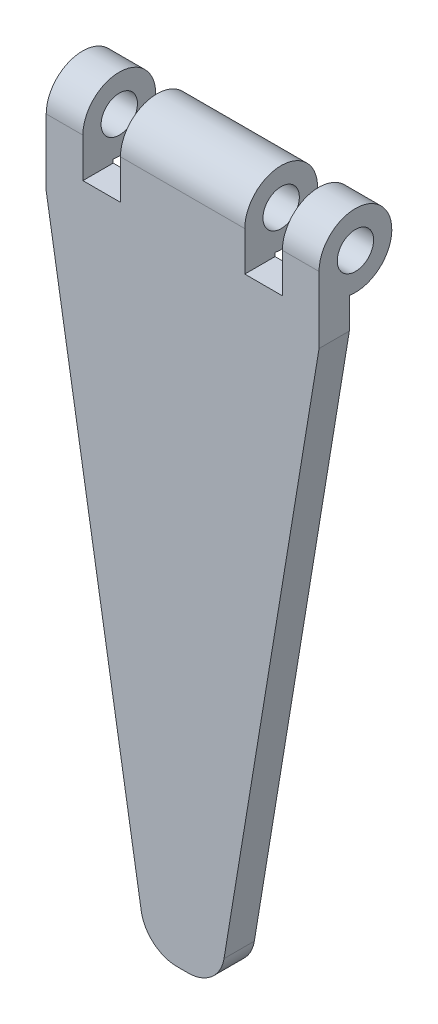
ISO-10303-21;
HEADER;
FILE_DESCRIPTION(('STEP AP214'),'2;1');
FILE_NAME('part.step','',(''),(''),'','','');
FILE_SCHEMA(('AUTOMOTIVE_DESIGN { 1 0 10303 214 1 1 1 1 }'));
ENDSEC;
DATA;
#1=APPLICATION_CONTEXT('core data for automotive mechanical design processes');
#2=APPLICATION_PROTOCOL_DEFINITION('international standard','automotive_design',2000,#1);
#3=PRODUCT_CONTEXT('',#1,'mechanical');
#4=PRODUCT('Part','Part','',(#3));
#5=PRODUCT_RELATED_PRODUCT_CATEGORY('part','',(#4));
#6=PRODUCT_DEFINITION_FORMATION('','',#4);
#7=PRODUCT_DEFINITION_CONTEXT('part definition',#1,'design');
#8=PRODUCT_DEFINITION('design','',#6,#7);
#9=PRODUCT_DEFINITION_SHAPE('','',#8);
#10=(LENGTH_UNIT() NAMED_UNIT(*) SI_UNIT(.MILLI.,.METRE.));
#11=(NAMED_UNIT(*) PLANE_ANGLE_UNIT() SI_UNIT($,.RADIAN.));
#12=(NAMED_UNIT(*) SI_UNIT($,.STERADIAN.) SOLID_ANGLE_UNIT());
#13=UNCERTAINTY_MEASURE_WITH_UNIT(LENGTH_MEASURE(1.E-05),#10,'distance_accuracy_value','');
#14=(GEOMETRIC_REPRESENTATION_CONTEXT(3) GLOBAL_UNCERTAINTY_ASSIGNED_CONTEXT((#13)) GLOBAL_UNIT_ASSIGNED_CONTEXT((#10,
#11,#12)) REPRESENTATION_CONTEXT('',''));
#15=CARTESIAN_POINT('',(0.,0.,0.));
#16=DIRECTION('',(0.,0.,1.));
#17=DIRECTION('',(1.,0.,0.));
#18=AXIS2_PLACEMENT_3D('',#15,#16,#17);
#19=CARTESIAN_POINT('',(0.,0.,5.));
#20=DIRECTION('',(0.,0.,-1.));
#21=DIRECTION('',(-1.,0.,0.));
#22=AXIS2_PLACEMENT_3D('',#19,#20,#21);
#23=PLANE('',#22);
#24=DIRECTION('',(1.,0.,0.));
#25=VECTOR('',#24,1.);
#26=CARTESIAN_POINT('',(-6.00000000000002,-108.5,5.));
#27=LINE('',#26,#25);
#28=CARTESIAN_POINT('',(-0.917358670530017,-108.5,5.));
#29=VERTEX_POINT('',#28);
#30=CARTESIAN_POINT('',(0.917358670529975,-108.5,5.));
#31=VERTEX_POINT('',#30);
#32=EDGE_CURVE('E239',#29,#31,#27,.T.);
#33=ORIENTED_EDGE('',*,*,#32,.T.);
#34=CARTESIAN_POINT('',(0.917358670529975,-102.51,5.));
#35=DIRECTION('',(0.,0.,-1.));
#36=DIRECTION('',(-1.,0.,0.));
#37=AXIS2_PLACEMENT_3D('',#34,#35,#36);
#38=CIRCLE('',#37,5.99);
#39=CARTESIAN_POINT('',(6.82744782282865,-103.485164710129,5.));
#40=VERTEX_POINT('',#39);
#41=EDGE_CURVE('E59',#31,#40,#38,.F.);
#42=ORIENTED_EDGE('',*,*,#41,.T.);
#43=DIRECTION('',(0.162798782993202,0.986659290867893,0.));
#44=VECTOR('',#43,1.);
#45=CARTESIAN_POINT('',(22.5,-8.5,5.));
#46=LINE('',#45,#44);
#47=CARTESIAN_POINT('',(22.5,-8.5,5.));
#48=VERTEX_POINT('',#47);
#49=EDGE_CURVE('E237',#40,#48,#46,.T.);
#50=ORIENTED_EDGE('',*,*,#49,.T.);
#51=DIRECTION('',(0.,1.,0.));
#52=VECTOR('',#51,1.);
#53=CARTESIAN_POINT('',(22.5,-8.5,5.));
#54=LINE('',#53,#52);
#55=CARTESIAN_POINT('',(22.5,2.5,5.));
#56=VERTEX_POINT('',#55);
#57=EDGE_CURVE('E184',#48,#56,#54,.T.);
#58=ORIENTED_EDGE('',*,*,#57,.T.);
#59=DIRECTION('',(1.,0.,0.));
#60=VECTOR('',#59,1.);
#61=CARTESIAN_POINT('',(-22.5,2.5,5.));
#62=LINE('',#61,#60);
#63=CARTESIAN_POINT('',(16.45,2.5,5.));
#64=VERTEX_POINT('',#63);
#65=EDGE_CURVE('E294',#64,#56,#62,.T.);
#66=ORIENTED_EDGE('',*,*,#65,.F.);
#67=DIRECTION('',(0.,1.,0.));
#68=VECTOR('',#67,1.);
#69=CARTESIAN_POINT('',(16.45,0.,5.));
#70=LINE('',#69,#68);
#71=CARTESIAN_POINT('',(16.45,-4.,5.));
#72=VERTEX_POINT('',#71);
#73=EDGE_CURVE('E275',#72,#64,#70,.T.);
#74=ORIENTED_EDGE('',*,*,#73,.F.);
#75=DIRECTION('',(1.,0.,0.));
#76=VECTOR('',#75,1.);
#77=CARTESIAN_POINT('',(0.,-4.,5.));
#78=LINE('',#77,#76);
#79=CARTESIAN_POINT('',(10.25,-4.,5.));
#80=VERTEX_POINT('',#79);
#81=EDGE_CURVE('E272',#80,#72,#78,.T.);
#82=ORIENTED_EDGE('',*,*,#81,.F.);
#83=DIRECTION('',(0.,1.,0.));
#84=VECTOR('',#83,1.);
#85=CARTESIAN_POINT('',(10.25,0.,5.));
#86=LINE('',#85,#84);
#87=CARTESIAN_POINT('',(10.25,2.5,5.));
#88=VERTEX_POINT('',#87);
#89=EDGE_CURVE('E256',#80,#88,#86,.T.);
#90=ORIENTED_EDGE('',*,*,#89,.T.);
#91=CARTESIAN_POINT('',(-10.25,2.5,5.));
#92=VERTEX_POINT('',#91);
#93=EDGE_CURVE('E299',#92,#88,#62,.T.);
#94=ORIENTED_EDGE('',*,*,#93,.F.);
#95=DIRECTION('',(0.,1.,0.));
#96=VECTOR('',#95,1.);
#97=CARTESIAN_POINT('',(-10.25,0.,5.));
#98=LINE('',#97,#96);
#99=CARTESIAN_POINT('',(-10.25,-4.,5.));
#100=VERTEX_POINT('',#99);
#101=EDGE_CURVE('E264',#100,#92,#98,.T.);
#102=ORIENTED_EDGE('',*,*,#101,.F.);
#103=DIRECTION('',(1.,0.,0.));
#104=VECTOR('',#103,1.);
#105=CARTESIAN_POINT('',(0.,-4.,5.));
#106=LINE('',#105,#104);
#107=CARTESIAN_POINT('',(-16.45,-4.,5.));
#108=VERTEX_POINT('',#107);
#109=EDGE_CURVE('E260',#108,#100,#106,.T.);
#110=ORIENTED_EDGE('',*,*,#109,.F.);
#111=DIRECTION('',(0.,1.,0.));
#112=VECTOR('',#111,1.);
#113=CARTESIAN_POINT('',(-16.45,0.,5.));
#114=LINE('',#113,#112);
#115=CARTESIAN_POINT('',(-16.45,2.5,5.));
#116=VERTEX_POINT('',#115);
#117=EDGE_CURVE('E257',#108,#116,#114,.T.);
#118=ORIENTED_EDGE('',*,*,#117,.T.);
#119=CARTESIAN_POINT('',(-22.5,2.5,5.));
#120=VERTEX_POINT('',#119);
#121=EDGE_CURVE('E295',#120,#116,#62,.T.);
#122=ORIENTED_EDGE('',*,*,#121,.F.);
#123=DIRECTION('',(0.,-1.,0.));
#124=VECTOR('',#123,1.);
#125=CARTESIAN_POINT('',(-22.5,-8.5,5.));
#126=LINE('',#125,#124);
#127=CARTESIAN_POINT('',(-22.5,-8.5,5.));
#128=VERTEX_POINT('',#127);
#129=EDGE_CURVE('E194',#120,#128,#126,.T.);
#130=ORIENTED_EDGE('',*,*,#129,.T.);
#131=DIRECTION('',(0.162798782993202,-0.986659290867893,0.));
#132=VECTOR('',#131,1.);
#133=CARTESIAN_POINT('',(-6.00000000000002,-108.5,5.));
#134=LINE('',#133,#132);
#135=CARTESIAN_POINT('',(-6.82744782282869,-103.485164710129,5.));
#136=VERTEX_POINT('',#135);
#137=EDGE_CURVE('E174',#128,#136,#134,.T.);
#138=ORIENTED_EDGE('',*,*,#137,.T.);
#139=CARTESIAN_POINT('',(-0.917358670530017,-102.51,5.));
#140=DIRECTION('',(0.,0.,-1.));
#141=DIRECTION('',(-1.,0.,0.));
#142=AXIS2_PLACEMENT_3D('',#139,#140,#141);
#143=CIRCLE('',#142,5.99);
#144=EDGE_CURVE('E232',#136,#29,#143,.F.);
#145=ORIENTED_EDGE('',*,*,#144,.T.);
#146=EDGE_LOOP('',(#33,#42,#50,#58,#66,#74,#82,#90,#94,#102,#110,#118,#122,#130,#138,#145));
#147=FACE_BOUND('',#146,.T.);
#148=ADVANCED_FACE('F51',(#147),#23,.F.);
#149=CARTESIAN_POINT('',(0.,0.,0.));
#150=DIRECTION('',(0.,0.,-1.));
#151=DIRECTION('',(-1.,0.,0.));
#152=AXIS2_PLACEMENT_3D('',#149,#150,#151);
#153=PLANE('',#152);
#154=DIRECTION('',(-0.162798782993202,-0.986659290867892,0.));
#155=VECTOR('',#154,1.);
#156=CARTESIAN_POINT('',(22.5,-8.5,0.));
#157=LINE('',#156,#155);
#158=CARTESIAN_POINT('',(22.5,-8.5,0.));
#159=VERTEX_POINT('',#158);
#160=CARTESIAN_POINT('',(6.82744782282866,-103.485164710129,0.));
#161=VERTEX_POINT('',#160);
#162=EDGE_CURVE('E249',#159,#161,#157,.T.);
#163=ORIENTED_EDGE('',*,*,#162,.T.);
#164=CARTESIAN_POINT('',(0.917358670529975,-102.51,0.));
#165=DIRECTION('',(0.,0.,-1.));
#166=DIRECTION('',(-1.,0.,0.));
#167=AXIS2_PLACEMENT_3D('',#164,#165,#166);
#168=CIRCLE('',#167,5.99);
#169=CARTESIAN_POINT('',(0.917358670529975,-108.5,0.));
#170=VERTEX_POINT('',#169);
#171=EDGE_CURVE('E226',#161,#170,#168,.T.);
#172=ORIENTED_EDGE('',*,*,#171,.T.);
#173=DIRECTION('',(-1.,0.,0.));
#174=VECTOR('',#173,1.);
#175=CARTESIAN_POINT('',(-6.00000000000002,-108.5,0.));
#176=LINE('',#175,#174);
#177=CARTESIAN_POINT('',(-0.917358670530017,-108.5,0.));
#178=VERTEX_POINT('',#177);
#179=EDGE_CURVE('E175',#170,#178,#176,.T.);
#180=ORIENTED_EDGE('',*,*,#179,.T.);
#181=CARTESIAN_POINT('',(-0.917358670530017,-102.51,0.));
#182=DIRECTION('',(0.,0.,-1.));
#183=DIRECTION('',(-1.,0.,0.));
#184=AXIS2_PLACEMENT_3D('',#181,#182,#183);
#185=CIRCLE('',#184,5.99);
#186=CARTESIAN_POINT('',(-6.82744782282869,-103.485164710129,0.));
#187=VERTEX_POINT('',#186);
#188=EDGE_CURVE('E172',#178,#187,#185,.T.);
#189=ORIENTED_EDGE('',*,*,#188,.T.);
#190=DIRECTION('',(-0.162798782993202,0.986659290867892,0.));
#191=VECTOR('',#190,1.);
#192=CARTESIAN_POINT('',(-6.00000000000002,-108.5,0.));
#193=LINE('',#192,#191);
#194=CARTESIAN_POINT('',(-22.5,-8.5,0.));
#195=VERTEX_POINT('',#194);
#196=EDGE_CURVE('E165',#187,#195,#193,.T.);
#197=ORIENTED_EDGE('',*,*,#196,.T.);
#198=DIRECTION('',(0.,-1.,0.));
#199=VECTOR('',#198,1.);
#200=CARTESIAN_POINT('',(-22.5,-8.5,0.));
#201=LINE('',#200,#199);
#202=CARTESIAN_POINT('',(-22.5,-3.41607978309962,0.));
#203=VERTEX_POINT('',#202);
#204=EDGE_CURVE('E170',#203,#195,#201,.T.);
#205=ORIENTED_EDGE('',*,*,#204,.F.);
#206=DIRECTION('',(1.,0.,0.));
#207=VECTOR('',#206,1.);
#208=CARTESIAN_POINT('',(-22.5,-3.41607978309962,0.));
#209=LINE('',#208,#207);
#210=CARTESIAN_POINT('',(-16.45,-3.41607978309962,0.));
#211=VERTEX_POINT('',#210);
#212=EDGE_CURVE('E188',#211,#203,#209,.F.);
#213=ORIENTED_EDGE('',*,*,#212,.F.);
#214=DIRECTION('',(0.,-1.,0.));
#215=VECTOR('',#214,1.);
#216=CARTESIAN_POINT('',(-16.45,0.,0.));
#217=LINE('',#216,#215);
#218=CARTESIAN_POINT('',(-16.45,-4.,0.));
#219=VERTEX_POINT('',#218);
#220=EDGE_CURVE('E291',#211,#219,#217,.T.);
#221=ORIENTED_EDGE('',*,*,#220,.T.);
#222=DIRECTION('',(-1.,0.,0.));
#223=VECTOR('',#222,1.);
#224=CARTESIAN_POINT('',(0.,-4.,0.));
#225=LINE('',#224,#223);
#226=CARTESIAN_POINT('',(-10.25,-4.,0.));
#227=VERTEX_POINT('',#226);
#228=EDGE_CURVE('E220',#227,#219,#225,.T.);
#229=ORIENTED_EDGE('',*,*,#228,.F.);
#230=DIRECTION('',(0.,-1.,0.));
#231=VECTOR('',#230,1.);
#232=CARTESIAN_POINT('',(-10.25,0.,0.));
#233=LINE('',#232,#231);
#234=CARTESIAN_POINT('',(-10.25,-3.41607978309962,0.));
#235=VERTEX_POINT('',#234);
#236=EDGE_CURVE('E218',#235,#227,#233,.T.);
#237=ORIENTED_EDGE('',*,*,#236,.F.);
#238=CARTESIAN_POINT('',(10.25,-3.41607978309962,0.));
#239=VERTEX_POINT('',#238);
#240=EDGE_CURVE('E191',#239,#235,#209,.F.);
#241=ORIENTED_EDGE('',*,*,#240,.F.);
#242=DIRECTION('',(0.,-1.,0.));
#243=VECTOR('',#242,1.);
#244=CARTESIAN_POINT('',(10.25,0.,0.));
#245=LINE('',#244,#243);
#246=CARTESIAN_POINT('',(10.25,-4.,0.));
#247=VERTEX_POINT('',#246);
#248=EDGE_CURVE('E213',#239,#247,#245,.T.);
#249=ORIENTED_EDGE('',*,*,#248,.T.);
#250=DIRECTION('',(-1.,0.,0.));
#251=VECTOR('',#250,1.);
#252=CARTESIAN_POINT('',(0.,-4.,0.));
#253=LINE('',#252,#251);
#254=CARTESIAN_POINT('',(16.45,-4.,0.));
#255=VERTEX_POINT('',#254);
#256=EDGE_CURVE('E198',#255,#247,#253,.T.);
#257=ORIENTED_EDGE('',*,*,#256,.F.);
#258=DIRECTION('',(0.,-1.,0.));
#259=VECTOR('',#258,1.);
#260=CARTESIAN_POINT('',(16.45,0.,0.));
#261=LINE('',#260,#259);
#262=CARTESIAN_POINT('',(16.45,-3.41607978309962,0.));
#263=VERTEX_POINT('',#262);
#264=EDGE_CURVE('E208',#263,#255,#261,.T.);
#265=ORIENTED_EDGE('',*,*,#264,.F.);
#266=CARTESIAN_POINT('',(22.5,-3.41607978309962,0.));
#267=VERTEX_POINT('',#266);
#268=EDGE_CURVE('E193',#267,#263,#209,.F.);
#269=ORIENTED_EDGE('',*,*,#268,.F.);
#270=DIRECTION('',(0.,1.,0.));
#271=VECTOR('',#270,1.);
#272=CARTESIAN_POINT('',(22.5,-8.5,0.));
#273=LINE('',#272,#271);
#274=EDGE_CURVE('E185',#159,#267,#273,.T.);
#275=ORIENTED_EDGE('',*,*,#274,.F.);
#276=EDGE_LOOP('',(#163,#172,#180,#189,#197,#205,#213,#221,#229,#237,#241,#249,#257,#265,#269,#275));
#277=FACE_BOUND('',#276,.T.);
#278=ADVANCED_FACE('F168',(#277),#153,.T.);
#279=CARTESIAN_POINT('',(-22.5,2.5,-1.));
#280=DIRECTION('',(1.,0.,0.));
#281=DIRECTION('',(0.,0.,-1.));
#282=AXIS2_PLACEMENT_3D('',#279,#280,#281);
#283=CYLINDRICAL_SURFACE('',#282,6.);
#284=ORIENTED_EDGE('',*,*,#121,.T.);
#285=CARTESIAN_POINT('',(-16.45,2.5,-1.));
#286=DIRECTION('',(1.,0.,0.));
#287=DIRECTION('',(0.,0.,-1.));
#288=AXIS2_PLACEMENT_3D('',#285,#286,#287);
#289=CIRCLE('',#288,6.);
#290=EDGE_CURVE('E217',#116,#211,#289,.F.);
#291=ORIENTED_EDGE('',*,*,#290,.T.);
#292=ORIENTED_EDGE('',*,*,#212,.T.);
#293=CARTESIAN_POINT('',(-22.5,2.5,-1.));
#294=DIRECTION('',(1.,0.,0.));
#295=DIRECTION('',(0.,0.,-1.));
#296=AXIS2_PLACEMENT_3D('',#293,#294,#295);
#297=CIRCLE('',#296,6.);
#298=EDGE_CURVE('E183',#203,#120,#297,.T.);
#299=ORIENTED_EDGE('',*,*,#298,.T.);
#300=EDGE_LOOP('',(#284,#291,#292,#299));
#301=FACE_BOUND('',#300,.T.);
#302=ADVANCED_FACE('F348',(#301),#283,.T.);
#303=CARTESIAN_POINT('',(-10.25,2.5,-1.));
#304=DIRECTION('',(1.,0.,0.));
#305=DIRECTION('',(0.,0.,-1.));
#306=AXIS2_PLACEMENT_3D('',#303,#304,#305);
#307=CIRCLE('',#306,6.);
#308=EDGE_CURVE('E212',#92,#235,#307,.F.);
#309=ORIENTED_EDGE('',*,*,#308,.F.);
#310=ORIENTED_EDGE('',*,*,#93,.T.);
#311=CARTESIAN_POINT('',(10.25,2.5,-1.));
#312=DIRECTION('',(1.,0.,0.));
#313=DIRECTION('',(0.,0.,-1.));
#314=AXIS2_PLACEMENT_3D('',#311,#312,#313);
#315=CIRCLE('',#314,6.);
#316=EDGE_CURVE('E207',#88,#239,#315,.F.);
#317=ORIENTED_EDGE('',*,*,#316,.T.);
#318=ORIENTED_EDGE('',*,*,#240,.T.);
#319=EDGE_LOOP('',(#309,#310,#317,#318));
#320=FACE_BOUND('',#319,.T.);
#321=ADVANCED_FACE('F324',(#320),#283,.T.);
#322=CARTESIAN_POINT('',(16.45,2.5,-1.));
#323=DIRECTION('',(1.,0.,0.));
#324=DIRECTION('',(0.,0.,-1.));
#325=AXIS2_PLACEMENT_3D('',#322,#323,#324);
#326=CIRCLE('',#325,6.);
#327=EDGE_CURVE('E202',#64,#263,#326,.F.);
#328=ORIENTED_EDGE('',*,*,#327,.F.);
#329=ORIENTED_EDGE('',*,*,#65,.T.);
#330=CARTESIAN_POINT('',(22.5,2.5,-1.));
#331=DIRECTION('',(1.,0.,0.));
#332=DIRECTION('',(0.,0.,-1.));
#333=AXIS2_PLACEMENT_3D('',#330,#331,#332);
#334=CIRCLE('',#333,6.);
#335=EDGE_CURVE('E303',#267,#56,#334,.T.);
#336=ORIENTED_EDGE('',*,*,#335,.F.);
#337=ORIENTED_EDGE('',*,*,#268,.T.);
#338=EDGE_LOOP('',(#328,#329,#336,#337));
#339=FACE_BOUND('',#338,.T.);
#340=ADVANCED_FACE('F318',(#339),#283,.T.);
#341=CARTESIAN_POINT('',(-22.5,2.5,-1.));
#342=DIRECTION('',(1.,0.,0.));
#343=DIRECTION('',(0.,0.,-1.));
#344=AXIS2_PLACEMENT_3D('',#341,#342,#343);
#345=CYLINDRICAL_SURFACE('',#344,3.);
#346=CARTESIAN_POINT('',(-22.5,2.5,-1.));
#347=DIRECTION('',(1.,0.,0.));
#348=DIRECTION('',(0.,0.,-1.));
#349=AXIS2_PLACEMENT_3D('',#346,#347,#348);
#350=CIRCLE('',#349,3.);
#351=CARTESIAN_POINT('',(-22.5,2.5,-4.));
#352=VERTEX_POINT('',#351);
#353=EDGE_CURVE('E300',#352,#352,#350,.T.);
#354=CARTESIAN_POINT('',(-16.45,2.5,-1.));
#355=DIRECTION('',(1.,0.,0.));
#356=DIRECTION('',(0.,0.,-1.));
#357=AXIS2_PLACEMENT_3D('',#354,#355,#356);
#358=CIRCLE('',#357,3.);
#359=CARTESIAN_POINT('',(-16.45,2.5,-4.));
#360=VERTEX_POINT('',#359);
#361=EDGE_CURVE('E214',#360,#360,#358,.F.);
#362=CARTESIAN_POINT('',(-22.5,2.5,-4.));
#363=CARTESIAN_POINT('',(-22.4369791666667,2.5,-4.));
#364=CARTESIAN_POINT('',(-22.3739583333333,2.5,-4.));
#365=CARTESIAN_POINT('',(-22.2479166666667,2.5,-4.));
#366=CARTESIAN_POINT('',(-22.1848958333333,2.5,-4.));
#367=CARTESIAN_POINT('',(-22.0588541666667,2.5,-4.));
#368=CARTESIAN_POINT('',(-21.9958333333333,2.5,-4.));
#369=CARTESIAN_POINT('',(-21.8697916666667,2.5,-4.));
#370=CARTESIAN_POINT('',(-21.8067708333333,2.5,-4.));
#371=CARTESIAN_POINT('',(-21.6807291666667,2.5,-4.));
#372=CARTESIAN_POINT('',(-21.6177083333333,2.5,-4.));
#373=CARTESIAN_POINT('',(-21.4916666666667,2.5,-4.));
#374=CARTESIAN_POINT('',(-21.4286458333333,2.5,-4.));
#375=CARTESIAN_POINT('',(-21.3026041666667,2.5,-4.));
#376=CARTESIAN_POINT('',(-21.2395833333333,2.5,-4.));
#377=CARTESIAN_POINT('',(-21.1135416666667,2.5,-4.));
#378=CARTESIAN_POINT('',(-21.0505208333333,2.5,-4.));
#379=CARTESIAN_POINT('',(-20.9244791666667,2.5,-4.));
#380=CARTESIAN_POINT('',(-20.8614583333333,2.5,-4.));
#381=CARTESIAN_POINT('',(-20.7354166666667,2.5,-4.));
#382=CARTESIAN_POINT('',(-20.6723958333333,2.5,-4.));
#383=CARTESIAN_POINT('',(-20.5463541666667,2.5,-4.));
#384=CARTESIAN_POINT('',(-20.4833333333333,2.5,-4.));
#385=CARTESIAN_POINT('',(-20.3572916666667,2.5,-4.));
#386=CARTESIAN_POINT('',(-20.2942708333333,2.5,-4.));
#387=CARTESIAN_POINT('',(-20.1682291666667,2.5,-4.));
#388=CARTESIAN_POINT('',(-20.1052083333333,2.5,-4.));
#389=CARTESIAN_POINT('',(-19.9791666666667,2.5,-4.));
#390=CARTESIAN_POINT('',(-19.9161458333333,2.5,-4.));
#391=CARTESIAN_POINT('',(-19.7901041666667,2.5,-4.));
#392=CARTESIAN_POINT('',(-19.7270833333333,2.5,-4.));
#393=CARTESIAN_POINT('',(-19.6010416666667,2.5,-4.));
#394=CARTESIAN_POINT('',(-19.5380208333333,2.5,-4.));
#395=CARTESIAN_POINT('',(-19.4119791666667,2.5,-4.));
#396=CARTESIAN_POINT('',(-19.3489583333333,2.5,-4.));
#397=CARTESIAN_POINT('',(-19.2229166666667,2.5,-4.));
#398=CARTESIAN_POINT('',(-19.1598958333333,2.5,-4.));
#399=CARTESIAN_POINT('',(-19.0338541666667,2.5,-4.));
#400=CARTESIAN_POINT('',(-18.9708333333333,2.5,-4.));
#401=CARTESIAN_POINT('',(-18.8447916666667,2.5,-4.));
#402=CARTESIAN_POINT('',(-18.7817708333333,2.5,-4.));
#403=CARTESIAN_POINT('',(-18.6557291666667,2.5,-4.));
#404=CARTESIAN_POINT('',(-18.5927083333333,2.5,-4.));
#405=CARTESIAN_POINT('',(-18.4666666666667,2.5,-4.));
#406=CARTESIAN_POINT('',(-18.4036458333333,2.5,-4.));
#407=CARTESIAN_POINT('',(-18.2776041666667,2.5,-4.));
#408=CARTESIAN_POINT('',(-18.2145833333333,2.5,-4.));
#409=CARTESIAN_POINT('',(-18.0885416666667,2.5,-4.));
#410=CARTESIAN_POINT('',(-18.0255208333333,2.5,-4.));
#411=CARTESIAN_POINT('',(-17.8994791666667,2.5,-4.));
#412=CARTESIAN_POINT('',(-17.8364583333333,2.5,-4.));
#413=CARTESIAN_POINT('',(-17.7104166666667,2.5,-4.));
#414=CARTESIAN_POINT('',(-17.6473958333333,2.5,-4.));
#415=CARTESIAN_POINT('',(-17.5213541666667,2.5,-4.));
#416=CARTESIAN_POINT('',(-17.4583333333333,2.5,-4.));
#417=CARTESIAN_POINT('',(-17.3322916666667,2.5,-4.));
#418=CARTESIAN_POINT('',(-17.2692708333333,2.5,-4.));
#419=CARTESIAN_POINT('',(-17.1432291666667,2.5,-4.));
#420=CARTESIAN_POINT('',(-17.0802083333333,2.5,-4.));
#421=CARTESIAN_POINT('',(-16.9541666666667,2.5,-4.));
#422=CARTESIAN_POINT('',(-16.8911458333333,2.5,-4.));
#423=CARTESIAN_POINT('',(-16.7651041666667,2.5,-4.));
#424=CARTESIAN_POINT('',(-16.7020833333333,2.5,-4.));
#425=CARTESIAN_POINT('',(-16.5760416666667,2.5,-4.));
#426=CARTESIAN_POINT('',(-16.5130208333333,2.5,-4.));
#427=CARTESIAN_POINT('',(-16.45,2.5,-4.));
#428=B_SPLINE_CURVE_WITH_KNOTS('',3,(#362,#363,#364,#365,#366,#367,#368,#369,#370,#371,#372,
#373,#374,#375,#376,#377,#378,#379,#380,#381,#382,#383,#384,#385,#386,#387,#388,#389,#390,#391,
#392,#393,#394,#395,#396,#397,#398,#399,#400,#401,#402,#403,#404,#405,#406,#407,#408,#409,#410,
#411,#412,#413,#414,#415,#416,#417,#418,#419,#420,#421,#422,#423,#424,#425,#426,#427),
.UNSPECIFIED.,.F.,.F.,(4,2,2,2,2,2,2,2,2,2,2,2,2,2,2,2,2,2,2,2,2,2,2,2,2,2,2,2,2,2,2,2,4),(0.,
0.1890625,0.378125,0.5671875,0.75625,0.9453125,1.134375,1.3234375,1.5125,1.7015625,1.890625,
2.0796875,2.26875,2.4578125,2.646875,2.8359375,3.025,3.2140625,3.403125,3.5921875,3.78125,
3.9703125,4.159375,4.3484375,4.5375,4.7265625,4.915625,5.1046875,5.29375,5.4828125,5.671875,
5.8609375,6.05),.UNSPECIFIED.);
#429=EDGE_CURVE('BSEAM356',#352,#360,#428,.T.);
#430=ORIENTED_EDGE('',*,*,#353,.F.);
#431=ORIENTED_EDGE('',*,*,#361,.F.);
#432=ORIENTED_EDGE('',*,*,#429,.T.);
#433=ORIENTED_EDGE('',*,*,#429,.F.);
#434=EDGE_LOOP('',(#430,#432,#431,#433));
#435=FACE_BOUND('',#434,.T.);
#436=ADVANCED_FACE('F356',(#435),#345,.F.);
#437=CARTESIAN_POINT('',(22.5,-8.5,5.));
#438=DIRECTION('',(-1.,0.,0.));
#439=DIRECTION('',(0.,0.,1.));
#440=AXIS2_PLACEMENT_3D('',#437,#438,#439);
#441=PLANE('',#440);
#442=CARTESIAN_POINT('',(22.5,2.5,-1.));
#443=DIRECTION('',(1.,0.,0.));
#444=DIRECTION('',(0.,0.,-1.));
#445=AXIS2_PLACEMENT_3D('',#442,#443,#444);
#446=CIRCLE('',#445,3.);
#447=CARTESIAN_POINT('',(22.5,2.5,-4.));
#448=VERTEX_POINT('',#447);
#449=EDGE_CURVE('E298',#448,#448,#446,.T.);
#450=ORIENTED_EDGE('',*,*,#449,.F.);
#451=EDGE_LOOP('',(#450));
#452=FACE_BOUND('',#451,.T.);
#453=ORIENTED_EDGE('',*,*,#335,.T.);
#454=ORIENTED_EDGE('',*,*,#57,.F.);
#455=DIRECTION('',(0.,0.,-1.));
#456=VECTOR('',#455,1.);
#457=CARTESIAN_POINT('',(22.5,-8.5,5.));
#458=LINE('',#457,#456);
#459=EDGE_CURVE('E189',#48,#159,#458,.T.);
#460=ORIENTED_EDGE('',*,*,#459,.T.);
#461=ORIENTED_EDGE('',*,*,#274,.T.);
#462=EDGE_LOOP('',(#453,#454,#460,#461));
#463=FACE_BOUND('',#462,.T.);
#464=ADVANCED_FACE('F313',(#452,#463),#441,.F.);
#465=CARTESIAN_POINT('',(-22.5,-8.5,5.));
#466=DIRECTION('',(1.,0.,0.));
#467=DIRECTION('',(0.,0.,-1.));
#468=AXIS2_PLACEMENT_3D('',#465,#466,#467);
#469=PLANE('',#468);
#470=ORIENTED_EDGE('',*,*,#353,.T.);
#471=EDGE_LOOP('',(#470));
#472=FACE_BOUND('',#471,.T.);
#473=ORIENTED_EDGE('',*,*,#129,.F.);
#474=ORIENTED_EDGE('',*,*,#298,.F.);
#475=ORIENTED_EDGE('',*,*,#204,.T.);
#476=DIRECTION('',(0.,0.,-1.));
#477=VECTOR('',#476,1.);
#478=CARTESIAN_POINT('',(-22.5,-8.5,5.));
#479=LINE('',#478,#477);
#480=EDGE_CURVE('E182',#128,#195,#479,.T.);
#481=ORIENTED_EDGE('',*,*,#480,.F.);
#482=EDGE_LOOP('',(#473,#474,#475,#481));
#483=FACE_BOUND('',#482,.T.);
#484=ADVANCED_FACE('F181',(#472,#483),#469,.F.);
#485=CARTESIAN_POINT('',(16.45,2.5,-1.));
#486=DIRECTION('',(1.,0.,0.));
#487=DIRECTION('',(0.,0.,-1.));
#488=AXIS2_PLACEMENT_3D('',#485,#486,#487);
#489=CIRCLE('',#488,3.);
#490=CARTESIAN_POINT('',(16.45,2.5,-4.));
#491=VERTEX_POINT('',#490);
#492=EDGE_CURVE('E199',#491,#491,#489,.F.);
#493=CARTESIAN_POINT('',(16.45,2.5,-4.));
#494=CARTESIAN_POINT('',(16.5130208333333,2.5,-4.));
#495=CARTESIAN_POINT('',(16.5760416666667,2.5,-4.));
#496=CARTESIAN_POINT('',(16.7020833333333,2.5,-4.));
#497=CARTESIAN_POINT('',(16.7651041666667,2.5,-4.));
#498=CARTESIAN_POINT('',(16.8911458333333,2.5,-4.));
#499=CARTESIAN_POINT('',(16.9541666666667,2.5,-4.));
#500=CARTESIAN_POINT('',(17.0802083333333,2.5,-4.));
#501=CARTESIAN_POINT('',(17.1432291666667,2.5,-4.));
#502=CARTESIAN_POINT('',(17.2692708333333,2.5,-4.));
#503=CARTESIAN_POINT('',(17.3322916666667,2.5,-4.));
#504=CARTESIAN_POINT('',(17.4583333333333,2.5,-4.));
#505=CARTESIAN_POINT('',(17.5213541666667,2.5,-4.));
#506=CARTESIAN_POINT('',(17.6473958333333,2.5,-4.));
#507=CARTESIAN_POINT('',(17.7104166666667,2.5,-4.));
#508=CARTESIAN_POINT('',(17.8364583333333,2.5,-4.));
#509=CARTESIAN_POINT('',(17.8994791666667,2.5,-4.));
#510=CARTESIAN_POINT('',(18.0255208333333,2.5,-4.));
#511=CARTESIAN_POINT('',(18.0885416666667,2.5,-4.));
#512=CARTESIAN_POINT('',(18.2145833333333,2.5,-4.));
#513=CARTESIAN_POINT('',(18.2776041666667,2.5,-4.));
#514=CARTESIAN_POINT('',(18.4036458333333,2.5,-4.));
#515=CARTESIAN_POINT('',(18.4666666666667,2.5,-4.));
#516=CARTESIAN_POINT('',(18.5927083333333,2.5,-4.));
#517=CARTESIAN_POINT('',(18.6557291666667,2.5,-4.));
#518=CARTESIAN_POINT('',(18.7817708333333,2.5,-4.));
#519=CARTESIAN_POINT('',(18.8447916666667,2.5,-4.));
#520=CARTESIAN_POINT('',(18.9708333333333,2.5,-4.));
#521=CARTESIAN_POINT('',(19.0338541666667,2.5,-4.));
#522=CARTESIAN_POINT('',(19.1598958333333,2.5,-4.));
#523=CARTESIAN_POINT('',(19.2229166666667,2.5,-4.));
#524=CARTESIAN_POINT('',(19.3489583333333,2.5,-4.));
#525=CARTESIAN_POINT('',(19.4119791666667,2.5,-4.));
#526=CARTESIAN_POINT('',(19.5380208333333,2.5,-4.));
#527=CARTESIAN_POINT('',(19.6010416666667,2.5,-4.));
#528=CARTESIAN_POINT('',(19.7270833333333,2.5,-4.));
#529=CARTESIAN_POINT('',(19.7901041666667,2.5,-4.));
#530=CARTESIAN_POINT('',(19.9161458333333,2.5,-4.));
#531=CARTESIAN_POINT('',(19.9791666666667,2.5,-4.));
#532=CARTESIAN_POINT('',(20.1052083333333,2.5,-4.));
#533=CARTESIAN_POINT('',(20.1682291666667,2.5,-4.));
#534=CARTESIAN_POINT('',(20.2942708333333,2.5,-4.));
#535=CARTESIAN_POINT('',(20.3572916666667,2.5,-4.));
#536=CARTESIAN_POINT('',(20.4833333333333,2.5,-4.));
#537=CARTESIAN_POINT('',(20.5463541666667,2.5,-4.));
#538=CARTESIAN_POINT('',(20.6723958333333,2.5,-4.));
#539=CARTESIAN_POINT('',(20.7354166666667,2.5,-4.));
#540=CARTESIAN_POINT('',(20.8614583333333,2.5,-4.));
#541=CARTESIAN_POINT('',(20.9244791666667,2.5,-4.));
#542=CARTESIAN_POINT('',(21.0505208333333,2.5,-4.));
#543=CARTESIAN_POINT('',(21.1135416666667,2.5,-4.));
#544=CARTESIAN_POINT('',(21.2395833333333,2.5,-4.));
#545=CARTESIAN_POINT('',(21.3026041666667,2.5,-4.));
#546=CARTESIAN_POINT('',(21.4286458333333,2.5,-4.));
#547=CARTESIAN_POINT('',(21.4916666666667,2.5,-4.));
#548=CARTESIAN_POINT('',(21.6177083333333,2.5,-4.));
#549=CARTESIAN_POINT('',(21.6807291666667,2.5,-4.));
#550=CARTESIAN_POINT('',(21.8067708333333,2.5,-4.));
#551=CARTESIAN_POINT('',(21.8697916666667,2.5,-4.));
#552=CARTESIAN_POINT('',(21.9958333333333,2.5,-4.));
#553=CARTESIAN_POINT('',(22.0588541666667,2.5,-4.));
#554=CARTESIAN_POINT('',(22.1848958333333,2.5,-4.));
#555=CARTESIAN_POINT('',(22.2479166666667,2.5,-4.));
#556=CARTESIAN_POINT('',(22.3739583333333,2.5,-4.));
#557=CARTESIAN_POINT('',(22.4369791666667,2.5,-4.));
#558=CARTESIAN_POINT('',(22.5,2.5,-4.));
#559=B_SPLINE_CURVE_WITH_KNOTS('',3,(#493,#494,#495,#496,#497,#498,#499,#500,#501,#502,#503,
#504,#505,#506,#507,#508,#509,#510,#511,#512,#513,#514,#515,#516,#517,#518,#519,#520,#521,#522,
#523,#524,#525,#526,#527,#528,#529,#530,#531,#532,#533,#534,#535,#536,#537,#538,#539,#540,#541,
#542,#543,#544,#545,#546,#547,#548,#549,#550,#551,#552,#553,#554,#555,#556,#557,#558),
.UNSPECIFIED.,.F.,.F.,(4,2,2,2,2,2,2,2,2,2,2,2,2,2,2,2,2,2,2,2,2,2,2,2,2,2,2,2,2,2,2,2,4),(0.,
0.189062500000003,0.378125,0.567187499999997,0.75625,0.945312500000003,1.134375,1.3234375,
1.5125,1.7015625,1.890625,2.0796875,2.26875,2.4578125,2.646875,2.8359375,3.025,3.2140625,
3.403125,3.5921875,3.78125,3.9703125,4.159375,4.3484375,4.5375,4.7265625,4.915625,5.1046875,
5.29375,5.4828125,5.671875,5.8609375,6.05),.UNSPECIFIED.);
#560=EDGE_CURVE('BSEAM360',#491,#448,#559,.T.);
#561=ORIENTED_EDGE('',*,*,#492,.T.);
#562=ORIENTED_EDGE('',*,*,#449,.T.);
#563=ORIENTED_EDGE('',*,*,#560,.T.);
#564=ORIENTED_EDGE('',*,*,#560,.F.);
#565=EDGE_LOOP('',(#561,#563,#562,#564));
#566=FACE_BOUND('',#565,.T.);
#567=ADVANCED_FACE('F360',(#566),#345,.F.);
#568=CARTESIAN_POINT('',(10.25,0.,-7.));
#569=DIRECTION('',(1.,0.,0.));
#570=DIRECTION('',(0.,0.,-1.));
#571=AXIS2_PLACEMENT_3D('',#568,#569,#570);
#572=PLANE('',#571);
#573=ORIENTED_EDGE('',*,*,#316,.F.);
#574=ORIENTED_EDGE('',*,*,#89,.F.);
#575=DIRECTION('',(0.,0.,1.));
#576=VECTOR('',#575,1.);
#577=CARTESIAN_POINT('',(10.25,-4.,-7.));
#578=LINE('',#577,#576);
#579=EDGE_CURVE('E278',#247,#80,#578,.T.);
#580=ORIENTED_EDGE('',*,*,#579,.F.);
#581=ORIENTED_EDGE('',*,*,#248,.F.);
#582=EDGE_LOOP('',(#573,#574,#580,#581));
#583=FACE_BOUND('',#582,.T.);
#584=CARTESIAN_POINT('',(10.25,2.5,-1.));
#585=DIRECTION('',(1.,0.,0.));
#586=DIRECTION('',(0.,0.,-1.));
#587=AXIS2_PLACEMENT_3D('',#584,#585,#586);
#588=CIRCLE('',#587,3.);
#589=CARTESIAN_POINT('',(10.25,2.5,-4.));
#590=VERTEX_POINT('',#589);
#591=EDGE_CURVE('E204',#590,#590,#588,.F.);
#592=ORIENTED_EDGE('',*,*,#591,.T.);
#593=EDGE_LOOP('',(#592));
#594=FACE_BOUND('',#593,.T.);
#595=ADVANCED_FACE('F333',(#583,#594),#572,.T.);
#596=CARTESIAN_POINT('',(16.45,0.,-7.));
#597=DIRECTION('',(1.,0.,0.));
#598=DIRECTION('',(0.,0.,-1.));
#599=AXIS2_PLACEMENT_3D('',#596,#597,#598);
#600=PLANE('',#599);
#601=ORIENTED_EDGE('',*,*,#264,.T.);
#602=DIRECTION('',(0.,0.,1.));
#603=VECTOR('',#602,1.);
#604=CARTESIAN_POINT('',(16.45,-4.,-7.));
#605=LINE('',#604,#603);
#606=EDGE_CURVE('E261',#255,#72,#605,.T.);
#607=ORIENTED_EDGE('',*,*,#606,.T.);
#608=ORIENTED_EDGE('',*,*,#73,.T.);
#609=ORIENTED_EDGE('',*,*,#327,.T.);
#610=EDGE_LOOP('',(#601,#607,#608,#609));
#611=FACE_BOUND('',#610,.T.);
#612=ORIENTED_EDGE('',*,*,#492,.F.);
#613=EDGE_LOOP('',(#612));
#614=FACE_BOUND('',#613,.T.);
#615=ADVANCED_FACE('F402',(#611,#614),#600,.F.);
#616=CARTESIAN_POINT('',(0.,-4.,-7.));
#617=DIRECTION('',(0.,-1.,0.));
#618=DIRECTION('',(0.,0.,-1.));
#619=AXIS2_PLACEMENT_3D('',#616,#617,#618);
#620=PLANE('',#619);
#621=ORIENTED_EDGE('',*,*,#256,.T.);
#622=ORIENTED_EDGE('',*,*,#579,.T.);
#623=ORIENTED_EDGE('',*,*,#81,.T.);
#624=ORIENTED_EDGE('',*,*,#606,.F.);
#625=EDGE_LOOP('',(#621,#622,#623,#624));
#626=FACE_BOUND('',#625,.T.);
#627=ADVANCED_FACE('F371',(#626),#620,.F.);
#628=CARTESIAN_POINT('',(-10.25,2.5,-1.));
#629=DIRECTION('',(1.,0.,0.));
#630=DIRECTION('',(0.,0.,-1.));
#631=AXIS2_PLACEMENT_3D('',#628,#629,#630);
#632=CIRCLE('',#631,3.);
#633=CARTESIAN_POINT('',(-10.25,2.5,-4.));
#634=VERTEX_POINT('',#633);
#635=EDGE_CURVE('E209',#634,#634,#632,.F.);
#636=CARTESIAN_POINT('',(-10.25,2.5,-4.));
#637=CARTESIAN_POINT('',(-10.0364583333333,2.5,-4.));
#638=CARTESIAN_POINT('',(-9.82291666666667,2.5,-4.));
#639=CARTESIAN_POINT('',(-9.39583333333333,2.5,-4.));
#640=CARTESIAN_POINT('',(-9.18229166666667,2.5,-4.));
#641=CARTESIAN_POINT('',(-8.75520833333333,2.5,-4.));
#642=CARTESIAN_POINT('',(-8.54166666666667,2.5,-4.));
#643=CARTESIAN_POINT('',(-8.11458333333333,2.5,-4.));
#644=CARTESIAN_POINT('',(-7.90104166666667,2.5,-4.));
#645=CARTESIAN_POINT('',(-7.47395833333333,2.5,-4.));
#646=CARTESIAN_POINT('',(-7.26041666666667,2.5,-4.));
#647=CARTESIAN_POINT('',(-6.83333333333333,2.5,-4.));
#648=CARTESIAN_POINT('',(-6.61979166666667,2.5,-4.));
#649=CARTESIAN_POINT('',(-6.19270833333334,2.5,-4.));
#650=CARTESIAN_POINT('',(-5.97916666666667,2.5,-4.));
#651=CARTESIAN_POINT('',(-5.55208333333334,2.5,-4.));
#652=CARTESIAN_POINT('',(-5.33854166666667,2.5,-4.));
#653=CARTESIAN_POINT('',(-4.91145833333333,2.5,-4.));
#654=CARTESIAN_POINT('',(-4.69791666666667,2.5,-4.));
#655=CARTESIAN_POINT('',(-4.27083333333333,2.5,-4.));
#656=CARTESIAN_POINT('',(-4.05729166666667,2.5,-4.));
#657=CARTESIAN_POINT('',(-3.63020833333333,2.5,-4.));
#658=CARTESIAN_POINT('',(-3.41666666666667,2.5,-4.));
#659=CARTESIAN_POINT('',(-2.98958333333333,2.5,-4.));
#660=CARTESIAN_POINT('',(-2.77604166666667,2.5,-4.));
#661=CARTESIAN_POINT('',(-2.34895833333333,2.5,-4.));
#662=CARTESIAN_POINT('',(-2.13541666666667,2.5,-4.));
#663=CARTESIAN_POINT('',(-1.70833333333333,2.5,-4.));
#664=CARTESIAN_POINT('',(-1.49479166666667,2.5,-4.));
#665=CARTESIAN_POINT('',(-1.06770833333333,2.5,-4.));
#666=CARTESIAN_POINT('',(-0.854166666666666,2.5,-4.));
#667=CARTESIAN_POINT('',(-0.427083333333332,2.5,-4.));
#668=CARTESIAN_POINT('',(-0.213541666666666,2.5,-4.));
#669=CARTESIAN_POINT('',(0.213541666666666,2.5,-4.));
#670=CARTESIAN_POINT('',(0.427083333333333,2.5,-4.));
#671=CARTESIAN_POINT('',(0.854166666666666,2.5,-4.));
#672=CARTESIAN_POINT('',(1.06770833333333,2.5,-4.));
#673=CARTESIAN_POINT('',(1.49479166666667,2.5,-4.));
#674=CARTESIAN_POINT('',(1.70833333333333,2.5,-4.));
#675=CARTESIAN_POINT('',(2.13541666666667,2.5,-4.));
#676=CARTESIAN_POINT('',(2.34895833333333,2.5,-4.));
#677=CARTESIAN_POINT('',(2.77604166666667,2.5,-4.));
#678=CARTESIAN_POINT('',(2.98958333333333,2.5,-4.));
#679=CARTESIAN_POINT('',(3.41666666666667,2.5,-4.));
#680=CARTESIAN_POINT('',(3.63020833333333,2.5,-4.));
#681=CARTESIAN_POINT('',(4.05729166666667,2.5,-4.));
#682=CARTESIAN_POINT('',(4.27083333333333,2.5,-4.));
#683=CARTESIAN_POINT('',(4.69791666666667,2.5,-4.));
#684=CARTESIAN_POINT('',(4.91145833333333,2.5,-4.));
#685=CARTESIAN_POINT('',(5.33854166666667,2.5,-4.));
#686=CARTESIAN_POINT('',(5.55208333333333,2.5,-4.));
#687=CARTESIAN_POINT('',(5.97916666666667,2.5,-4.));
#688=CARTESIAN_POINT('',(6.19270833333333,2.5,-4.));
#689=CARTESIAN_POINT('',(6.61979166666667,2.5,-4.));
#690=CARTESIAN_POINT('',(6.83333333333333,2.5,-4.));
#691=CARTESIAN_POINT('',(7.26041666666667,2.5,-4.));
#692=CARTESIAN_POINT('',(7.47395833333333,2.5,-4.));
#693=CARTESIAN_POINT('',(7.90104166666667,2.5,-4.));
#694=CARTESIAN_POINT('',(8.11458333333333,2.5,-4.));
#695=CARTESIAN_POINT('',(8.54166666666667,2.5,-4.));
#696=CARTESIAN_POINT('',(8.75520833333334,2.5,-4.));
#697=CARTESIAN_POINT('',(9.18229166666667,2.5,-4.));
#698=CARTESIAN_POINT('',(9.39583333333333,2.5,-4.));
#699=CARTESIAN_POINT('',(9.82291666666667,2.5,-4.));
#700=CARTESIAN_POINT('',(10.0364583333333,2.5,-4.));
#701=CARTESIAN_POINT('',(10.25,2.5,-4.));
#702=B_SPLINE_CURVE_WITH_KNOTS('',3,(#636,#637,#638,#639,#640,#641,#642,#643,#644,#645,#646,
#647,#648,#649,#650,#651,#652,#653,#654,#655,#656,#657,#658,#659,#660,#661,#662,#663,#664,#665,
#666,#667,#668,#669,#670,#671,#672,#673,#674,#675,#676,#677,#678,#679,#680,#681,#682,#683,#684,
#685,#686,#687,#688,#689,#690,#691,#692,#693,#694,#695,#696,#697,#698,#699,#700,#701),
.UNSPECIFIED.,.F.,.F.,(4,2,2,2,2,2,2,2,2,2,2,2,2,2,2,2,2,2,2,2,2,2,2,2,2,2,2,2,2,2,2,2,4),(0.,
0.640625000000001,1.28125,1.921875,2.5625,3.203125,3.84375,4.484375,5.125,5.765625,6.40625,
7.046875,7.6875,8.328125,8.96875,9.609375,10.25,10.890625,11.53125,12.171875,12.8125,13.453125,
14.09375,14.734375,15.375,16.015625,16.65625,17.296875,17.9375,18.578125,19.21875,19.859375,
20.5),.UNSPECIFIED.);
#703=EDGE_CURVE('BSEAM352',#634,#590,#702,.T.);
#704=ORIENTED_EDGE('',*,*,#635,.T.);
#705=ORIENTED_EDGE('',*,*,#591,.F.);
#706=ORIENTED_EDGE('',*,*,#703,.T.);
#707=ORIENTED_EDGE('',*,*,#703,.F.);
#708=EDGE_LOOP('',(#704,#706,#705,#707));
#709=FACE_BOUND('',#708,.T.);
#710=ADVANCED_FACE('F352',(#709),#345,.F.);
#711=CARTESIAN_POINT('',(-16.45,0.,-7.));
#712=DIRECTION('',(1.,0.,0.));
#713=DIRECTION('',(0.,0.,-1.));
#714=AXIS2_PLACEMENT_3D('',#711,#712,#713);
#715=PLANE('',#714);
#716=ORIENTED_EDGE('',*,*,#290,.F.);
#717=ORIENTED_EDGE('',*,*,#117,.F.);
#718=DIRECTION('',(0.,0.,1.));
#719=VECTOR('',#718,1.);
#720=CARTESIAN_POINT('',(-16.45,-4.,-7.));
#721=LINE('',#720,#719);
#722=EDGE_CURVE('E267',#219,#108,#721,.T.);
#723=ORIENTED_EDGE('',*,*,#722,.F.);
#724=ORIENTED_EDGE('',*,*,#220,.F.);
#725=EDGE_LOOP('',(#716,#717,#723,#724));
#726=FACE_BOUND('',#725,.T.);
#727=ORIENTED_EDGE('',*,*,#361,.T.);
#728=EDGE_LOOP('',(#727));
#729=FACE_BOUND('',#728,.T.);
#730=ADVANCED_FACE('F349',(#726,#729),#715,.T.);
#731=CARTESIAN_POINT('',(-10.25,0.,-7.));
#732=DIRECTION('',(1.,0.,0.));
#733=DIRECTION('',(0.,0.,-1.));
#734=AXIS2_PLACEMENT_3D('',#731,#732,#733);
#735=PLANE('',#734);
#736=ORIENTED_EDGE('',*,*,#236,.T.);
#737=DIRECTION('',(0.,0.,1.));
#738=VECTOR('',#737,1.);
#739=CARTESIAN_POINT('',(-10.25,-4.,-7.));
#740=LINE('',#739,#738);
#741=EDGE_CURVE('E203',#227,#100,#740,.T.);
#742=ORIENTED_EDGE('',*,*,#741,.T.);
#743=ORIENTED_EDGE('',*,*,#101,.T.);
#744=ORIENTED_EDGE('',*,*,#308,.T.);
#745=EDGE_LOOP('',(#736,#742,#743,#744));
#746=FACE_BOUND('',#745,.T.);
#747=ORIENTED_EDGE('',*,*,#635,.F.);
#748=EDGE_LOOP('',(#747));
#749=FACE_BOUND('',#748,.T.);
#750=ADVANCED_FACE('F339',(#746,#749),#735,.F.);
#751=CARTESIAN_POINT('',(0.,-4.,-7.));
#752=DIRECTION('',(0.,-1.,0.));
#753=DIRECTION('',(0.,0.,-1.));
#754=AXIS2_PLACEMENT_3D('',#751,#752,#753);
#755=PLANE('',#754);
#756=ORIENTED_EDGE('',*,*,#228,.T.);
#757=ORIENTED_EDGE('',*,*,#722,.T.);
#758=ORIENTED_EDGE('',*,*,#109,.T.);
#759=ORIENTED_EDGE('',*,*,#741,.F.);
#760=EDGE_LOOP('',(#756,#757,#758,#759));
#761=FACE_BOUND('',#760,.T.);
#762=ADVANCED_FACE('F342',(#761),#755,.F.);
#763=CARTESIAN_POINT('',(22.5,-8.5,114.658560997307));
#764=DIRECTION('',(0.986659290867892,-0.162798782993202,0.));
#765=DIRECTION('',(0.162798782993202,0.986659290867893,0.));
#766=AXIS2_PLACEMENT_3D('',#763,#764,#765);
#767=PLANE('',#766);
#768=ORIENTED_EDGE('',*,*,#49,.F.);
#769=DIRECTION('',(0.,0.,-1.));
#770=VECTOR('',#769,1.);
#771=CARTESIAN_POINT('',(6.82744782282865,-103.485164710129,114.658560997307));
#772=LINE('',#771,#770);
#773=EDGE_CURVE('E222',#40,#161,#772,.T.);
#774=ORIENTED_EDGE('',*,*,#773,.T.);
#775=ORIENTED_EDGE('',*,*,#162,.F.);
#776=ORIENTED_EDGE('',*,*,#459,.F.);
#777=EDGE_LOOP('',(#768,#774,#775,#776));
#778=FACE_BOUND('',#777,.T.);
#779=ADVANCED_FACE('F244',(#778),#767,.T.);
#780=CARTESIAN_POINT('',(-6.00000000000002,-108.5,114.658560997307));
#781=DIRECTION('',(-0.986659290867892,-0.162798782993202,0.));
#782=DIRECTION('',(0.162798782993202,-0.986659290867893,0.));
#783=AXIS2_PLACEMENT_3D('',#780,#781,#782);
#784=PLANE('',#783);
#785=ORIENTED_EDGE('',*,*,#196,.F.);
#786=DIRECTION('',(0.,0.,-1.));
#787=VECTOR('',#786,1.);
#788=CARTESIAN_POINT('',(-6.82744782282869,-103.485164710129,114.658560997307));
#789=LINE('',#788,#787);
#790=EDGE_CURVE('E12',#187,#136,#789,.F.);
#791=ORIENTED_EDGE('',*,*,#790,.T.);
#792=ORIENTED_EDGE('',*,*,#137,.F.);
#793=ORIENTED_EDGE('',*,*,#480,.T.);
#794=EDGE_LOOP('',(#785,#791,#792,#793));
#795=FACE_BOUND('',#794,.T.);
#796=ADVANCED_FACE('F187',(#795),#784,.T.);
#797=CARTESIAN_POINT('',(-6.00000000000002,-108.5,114.658560997307));
#798=DIRECTION('',(0.,-1.,0.));
#799=DIRECTION('',(0.,0.,-1.));
#800=AXIS2_PLACEMENT_3D('',#797,#798,#799);
#801=PLANE('',#800);
#802=ORIENTED_EDGE('',*,*,#179,.F.);
#803=DIRECTION('',(0.,0.,-1.));
#804=VECTOR('',#803,1.);
#805=CARTESIAN_POINT('',(0.917358670529975,-108.5,114.658560997307));
#806=LINE('',#805,#804);
#807=EDGE_CURVE('E72',#170,#31,#806,.F.);
#808=ORIENTED_EDGE('',*,*,#807,.T.);
#809=ORIENTED_EDGE('',*,*,#32,.F.);
#810=DIRECTION('',(0.,0.,-1.));
#811=VECTOR('',#810,1.);
#812=CARTESIAN_POINT('',(-0.917358670530017,-108.5,114.658560997307));
#813=LINE('',#812,#811);
#814=EDGE_CURVE('E228',#29,#178,#813,.T.);
#815=ORIENTED_EDGE('',*,*,#814,.T.);
#816=EDGE_LOOP('',(#802,#808,#809,#815));
#817=FACE_BOUND('',#816,.T.);
#818=ADVANCED_FACE('F250',(#817),#801,.T.);
#819=CARTESIAN_POINT('',(0.917358670529975,-102.51,114.658560997307));
#820=DIRECTION('',(0.,0.,-1.));
#821=DIRECTION('',(-1.,0.,0.));
#822=AXIS2_PLACEMENT_3D('',#819,#820,#821);
#823=CYLINDRICAL_SURFACE('',#822,5.99);
#824=ORIENTED_EDGE('',*,*,#41,.F.);
#825=ORIENTED_EDGE('',*,*,#807,.F.);
#826=ORIENTED_EDGE('',*,*,#171,.F.);
#827=ORIENTED_EDGE('',*,*,#773,.F.);
#828=EDGE_LOOP('',(#824,#825,#826,#827));
#829=FACE_BOUND('',#828,.T.);
#830=ADVANCED_FACE('F247',(#829),#823,.T.);
#831=CARTESIAN_POINT('',(-0.917358670530017,-102.51,114.658560997307));
#832=DIRECTION('',(0.,0.,-1.));
#833=DIRECTION('',(-1.,0.,0.));
#834=AXIS2_PLACEMENT_3D('',#831,#832,#833);
#835=CYLINDRICAL_SURFACE('',#834,5.99);
#836=ORIENTED_EDGE('',*,*,#144,.F.);
#837=ORIENTED_EDGE('',*,*,#790,.F.);
#838=ORIENTED_EDGE('',*,*,#188,.F.);
#839=ORIENTED_EDGE('',*,*,#814,.F.);
#840=EDGE_LOOP('',(#836,#837,#838,#839));
#841=FACE_BOUND('',#840,.T.);
#842=ADVANCED_FACE('F53',(#841),#835,.T.);
#843=CLOSED_SHELL('',(#148,#278,#302,#321,#340,#436,#464,#484,#567,#595,#615,#627,#710,#730,
#750,#762,#779,#796,#818,#830,#842));
#844=MANIFOLD_SOLID_BREP('B2',#843);
#845=ADVANCED_BREP_SHAPE_REPRESENTATION('',(#18,#844),#14);
#846=SHAPE_DEFINITION_REPRESENTATION(#9,#845);
ENDSEC;
END-ISO-10303-21;
